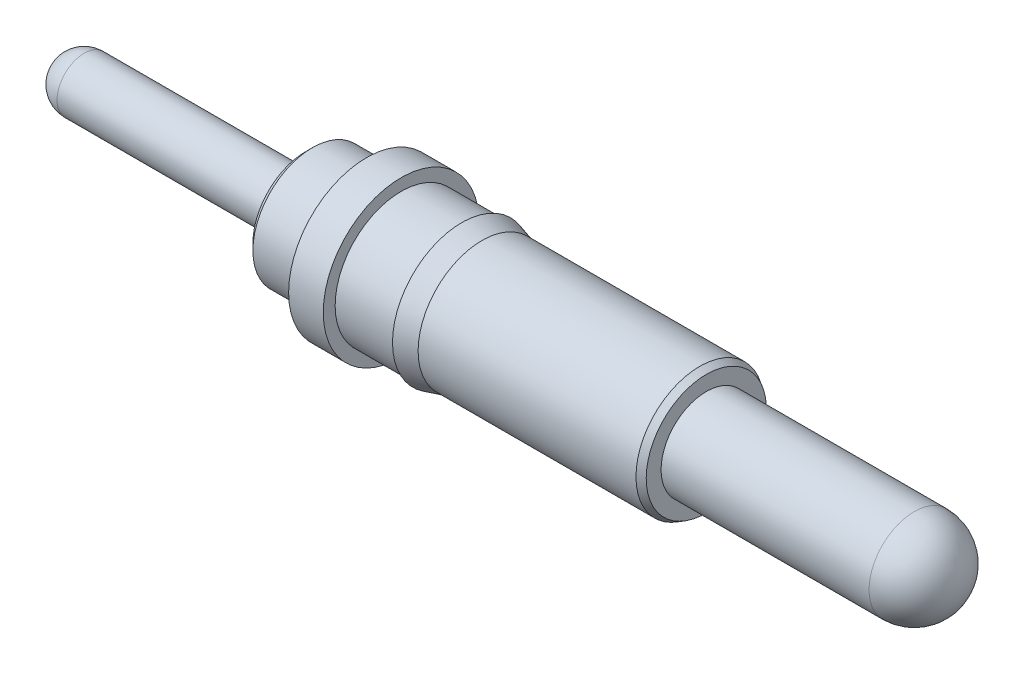
ISO-10303-21;
HEADER;
FILE_DESCRIPTION(('STEP AP214'),'2;1');
FILE_NAME('part.step','',(''),(''),'','','');
FILE_SCHEMA(('AUTOMOTIVE_DESIGN { 1 0 10303 214 1 1 1 1 }'));
ENDSEC;
DATA;
#1=APPLICATION_CONTEXT('core data for automotive mechanical design processes');
#2=APPLICATION_PROTOCOL_DEFINITION('international standard','automotive_design',2000,#1);
#3=PRODUCT_CONTEXT('',#1,'mechanical');
#4=PRODUCT('Part','Part','',(#3));
#5=PRODUCT_RELATED_PRODUCT_CATEGORY('part','',(#4));
#6=PRODUCT_DEFINITION_FORMATION('','',#4);
#7=PRODUCT_DEFINITION_CONTEXT('part definition',#1,'design');
#8=PRODUCT_DEFINITION('design','',#6,#7);
#9=PRODUCT_DEFINITION_SHAPE('','',#8);
#10=(LENGTH_UNIT() NAMED_UNIT(*) SI_UNIT(.MILLI.,.METRE.));
#11=(NAMED_UNIT(*) PLANE_ANGLE_UNIT() SI_UNIT($,.RADIAN.));
#12=(NAMED_UNIT(*) SI_UNIT($,.STERADIAN.) SOLID_ANGLE_UNIT());
#13=UNCERTAINTY_MEASURE_WITH_UNIT(LENGTH_MEASURE(1.E-05),#10,'distance_accuracy_value','');
#14=(GEOMETRIC_REPRESENTATION_CONTEXT(3) GLOBAL_UNCERTAINTY_ASSIGNED_CONTEXT((#13)) GLOBAL_UNIT_ASSIGNED_CONTEXT((#10,
#11,#12)) REPRESENTATION_CONTEXT('',''));
#15=CARTESIAN_POINT('',(0.,0.,0.));
#16=DIRECTION('',(0.,0.,1.));
#17=DIRECTION('',(1.,0.,0.));
#18=AXIS2_PLACEMENT_3D('',#15,#16,#17);
#19=CARTESIAN_POINT('',(0.317499999999853,1.69894480428479E-13,0.));
#20=DIRECTION('',(-1.,0.,0.));
#21=DIRECTION('',(0.,1.,0.));
#22=AXIS2_PLACEMENT_3D('',#19,#20,#21);
#23=SPHERICAL_SURFACE('',#22,0.317499999999853);
#24=CARTESIAN_POINT('',(0.317499999999853,0.,0.));
#25=DIRECTION('',(-1.,0.,0.));
#26=DIRECTION('',(0.,0.,1.));
#27=AXIS2_PLACEMENT_3D('',#24,#25,#26);
#28=CIRCLE('',#27,0.317500000000023);
#29=CARTESIAN_POINT('',(0.317499999999853,0.,0.317500000000023));
#30=VERTEX_POINT('',#29);
#31=EDGE_CURVE('E81',#30,#30,#28,.T.);
#32=ORIENTED_EDGE('',*,*,#31,.T.);
#33=EDGE_LOOP('',(#32));
#34=FACE_BOUND('',#33,.T.);
#35=ADVANCED_FACE('F32',(#34),#23,.T.);
#36=CARTESIAN_POINT('',(10.0609400000001,0.,0.));
#37=DIRECTION('',(-1.,0.,0.));
#38=DIRECTION('',(0.,1.,0.));
#39=AXIS2_PLACEMENT_3D('',#36,#37,#38);
#40=SPHERICAL_SURFACE('',#39,0.530859999999943);
#41=CARTESIAN_POINT('',(10.0609400000001,0.,0.));
#42=DIRECTION('',(-1.,0.,0.));
#43=DIRECTION('',(0.,0.,1.));
#44=AXIS2_PLACEMENT_3D('',#41,#42,#43);
#45=CIRCLE('',#44,0.530859999999943);
#46=CARTESIAN_POINT('',(10.0609400000001,0.,0.530859999999943));
#47=VERTEX_POINT('',#46);
#48=EDGE_CURVE('E10',#47,#47,#45,.T.);
#49=ORIENTED_EDGE('',*,*,#48,.F.);
#50=EDGE_LOOP('',(#49));
#51=FACE_BOUND('',#50,.T.);
#52=ADVANCED_FACE('F165',(#51),#40,.T.);
#53=CARTESIAN_POINT('',(0.,0.,0.));
#54=DIRECTION('',(-1.,0.,0.));
#55=DIRECTION('',(0.,0.,1.));
#56=AXIS2_PLACEMENT_3D('',#53,#54,#55);
#57=CYLINDRICAL_SURFACE('',#56,0.530859999999915);
#58=CARTESIAN_POINT('',(7.6200000000001,0.,0.));
#59=DIRECTION('',(-1.,0.,0.));
#60=DIRECTION('',(0.,0.,1.));
#61=AXIS2_PLACEMENT_3D('',#58,#59,#60);
#62=CIRCLE('',#61,0.530859999999887);
#63=CARTESIAN_POINT('',(7.6200000000001,0.,0.530859999999887));
#64=VERTEX_POINT('',#63);
#65=EDGE_CURVE('E38',#64,#64,#62,.T.);
#66=ORIENTED_EDGE('',*,*,#65,.F.);
#67=EDGE_LOOP('',(#66));
#68=FACE_BOUND('',#67,.T.);
#69=ORIENTED_EDGE('',*,*,#48,.T.);
#70=EDGE_LOOP('',(#69));
#71=FACE_BOUND('',#70,.T.);
#72=ADVANCED_FACE('F160',(#68,#71),#57,.T.);
#73=CARTESIAN_POINT('',(7.6200000000001,0.705305909487751,0.));
#74=DIRECTION('',(-1.,0.,0.));
#75=DIRECTION('',(0.,0.,1.));
#76=AXIS2_PLACEMENT_3D('',#73,#74,#75);
#77=PLANE('',#76);
#78=CARTESIAN_POINT('',(7.6200000000001,0.,0.));
#79=DIRECTION('',(-1.,0.,0.));
#80=DIRECTION('',(0.,0.,1.));
#81=AXIS2_PLACEMENT_3D('',#78,#79,#80);
#82=CIRCLE('',#81,0.705305909487751);
#83=CARTESIAN_POINT('',(7.6200000000001,0.,0.705305909487751));
#84=VERTEX_POINT('',#83);
#85=EDGE_CURVE('E42',#84,#84,#82,.T.);
#86=ORIENTED_EDGE('',*,*,#85,.F.);
#87=EDGE_LOOP('',(#86));
#88=FACE_BOUND('',#87,.T.);
#89=ORIENTED_EDGE('',*,*,#65,.T.);
#90=EDGE_LOOP('',(#89));
#91=FACE_BOUND('',#90,.T.);
#92=ADVANCED_FACE('F155',(#88,#91),#77,.F.);
#93=CARTESIAN_POINT('',(7.6200000000001,0.,0.));
#94=DIRECTION('',(-1.,0.,0.));
#95=DIRECTION('',(0.,0.,1.));
#96=AXIS2_PLACEMENT_3D('',#93,#94,#95);
#97=CONICAL_SURFACE('',#96,0.705305909487751,0.523598775598372);
#98=CARTESIAN_POINT('',(7.54380000000005,0.,0.));
#99=DIRECTION('',(-1.,0.,0.));
#100=DIRECTION('',(0.,0.,1.));
#101=AXIS2_PLACEMENT_3D('',#98,#99,#100);
#102=CIRCLE('',#101,0.749300000000036);
#103=CARTESIAN_POINT('',(7.54380000000005,0.,0.749300000000036));
#104=VERTEX_POINT('',#103);
#105=EDGE_CURVE('E46',#104,#104,#102,.T.);
#106=ORIENTED_EDGE('',*,*,#105,.F.);
#107=EDGE_LOOP('',(#106));
#108=FACE_BOUND('',#107,.T.);
#109=ORIENTED_EDGE('',*,*,#85,.T.);
#110=EDGE_LOOP('',(#109));
#111=FACE_BOUND('',#110,.T.);
#112=ADVANCED_FACE('F149',(#108,#111),#97,.T.);
#113=CARTESIAN_POINT('',(0.,0.,0.));
#114=DIRECTION('',(-1.,0.,0.));
#115=DIRECTION('',(0.,0.,1.));
#116=AXIS2_PLACEMENT_3D('',#113,#114,#115);
#117=CYLINDRICAL_SURFACE('',#116,0.749300000000036);
#118=CARTESIAN_POINT('',(4.98678522628056,0.,0.));
#119=DIRECTION('',(-1.,0.,0.));
#120=DIRECTION('',(0.,0.,1.));
#121=AXIS2_PLACEMENT_3D('',#118,#119,#120);
#122=CIRCLE('',#121,0.749300000000036);
#123=CARTESIAN_POINT('',(4.98678522628056,0.,0.749300000000036));
#124=VERTEX_POINT('',#123);
#125=EDGE_CURVE('E51',#124,#124,#122,.T.);
#126=ORIENTED_EDGE('',*,*,#125,.F.);
#127=EDGE_LOOP('',(#126));
#128=FACE_BOUND('',#127,.T.);
#129=ORIENTED_EDGE('',*,*,#105,.T.);
#130=EDGE_LOOP('',(#129));
#131=FACE_BOUND('',#130,.T.);
#132=ADVANCED_FACE('F143',(#128,#131),#117,.T.);
#133=CARTESIAN_POINT('',(4.98678522628056,0.,0.));
#134=DIRECTION('',(-1.,0.,0.));
#135=DIRECTION('',(0.,0.,1.));
#136=AXIS2_PLACEMENT_3D('',#133,#134,#135);
#137=CONICAL_SURFACE('',#136,0.749300000000036,0.261799387799377);
#138=CARTESIAN_POINT('',(4.74980000000002,0.,0.));
#139=DIRECTION('',(-1.,0.,0.));
#140=DIRECTION('',(0.,0.,1.));
#141=AXIS2_PLACEMENT_3D('',#138,#139,#140);
#142=CIRCLE('',#141,0.812800000000071);
#143=CARTESIAN_POINT('',(4.74980000000002,0.,0.812800000000071));
#144=VERTEX_POINT('',#143);
#145=EDGE_CURVE('E54',#144,#144,#142,.T.);
#146=ORIENTED_EDGE('',*,*,#145,.F.);
#147=EDGE_LOOP('',(#146));
#148=FACE_BOUND('',#147,.T.);
#149=ORIENTED_EDGE('',*,*,#125,.T.);
#150=EDGE_LOOP('',(#149));
#151=FACE_BOUND('',#150,.T.);
#152=ADVANCED_FACE('F137',(#148,#151),#137,.T.);
#153=CARTESIAN_POINT('',(4.74980000000002,0.774700000000045,0.));
#154=DIRECTION('',(1.,0.,0.));
#155=DIRECTION('',(0.,0.,-1.));
#156=AXIS2_PLACEMENT_3D('',#153,#154,#155);
#157=PLANE('',#156);
#158=CARTESIAN_POINT('',(4.74980000000002,0.,0.));
#159=DIRECTION('',(-1.,0.,0.));
#160=DIRECTION('',(0.,0.,1.));
#161=AXIS2_PLACEMENT_3D('',#158,#159,#160);
#162=CIRCLE('',#161,0.774700000000045);
#163=CARTESIAN_POINT('',(4.74980000000002,0.,0.774700000000045));
#164=VERTEX_POINT('',#163);
#165=EDGE_CURVE('E57',#164,#164,#162,.T.);
#166=ORIENTED_EDGE('',*,*,#165,.F.);
#167=EDGE_LOOP('',(#166));
#168=FACE_BOUND('',#167,.T.);
#169=ORIENTED_EDGE('',*,*,#145,.T.);
#170=EDGE_LOOP('',(#169));
#171=FACE_BOUND('',#170,.T.);
#172=ADVANCED_FACE('F131',(#168,#171),#157,.F.);
#173=CARTESIAN_POINT('',(0.,0.,0.));
#174=DIRECTION('',(-1.,0.,0.));
#175=DIRECTION('',(0.,0.,1.));
#176=AXIS2_PLACEMENT_3D('',#173,#174,#175);
#177=CYLINDRICAL_SURFACE('',#176,0.774700000000045);
#178=CARTESIAN_POINT('',(4.03860000000005,0.,0.));
#179=DIRECTION('',(-1.,0.,0.));
#180=DIRECTION('',(0.,0.,1.));
#181=AXIS2_PLACEMENT_3D('',#178,#179,#180);
#182=CIRCLE('',#181,0.774700000000045);
#183=CARTESIAN_POINT('',(4.03860000000005,0.,0.774700000000045));
#184=VERTEX_POINT('',#183);
#185=EDGE_CURVE('E60',#184,#184,#182,.T.);
#186=ORIENTED_EDGE('',*,*,#185,.F.);
#187=EDGE_LOOP('',(#186));
#188=FACE_BOUND('',#187,.T.);
#189=ORIENTED_EDGE('',*,*,#165,.T.);
#190=EDGE_LOOP('',(#189));
#191=FACE_BOUND('',#190,.T.);
#192=ADVANCED_FACE('F125',(#188,#191),#177,.T.);
#193=CARTESIAN_POINT('',(4.03860000000005,0.914400000000037,0.));
#194=DIRECTION('',(-1.,0.,0.));
#195=DIRECTION('',(0.,0.,1.));
#196=AXIS2_PLACEMENT_3D('',#193,#194,#195);
#197=PLANE('',#196);
#198=CARTESIAN_POINT('',(4.03860000000005,0.,0.));
#199=DIRECTION('',(-1.,0.,0.));
#200=DIRECTION('',(0.,0.,1.));
#201=AXIS2_PLACEMENT_3D('',#198,#199,#200);
#202=CIRCLE('',#201,0.914400000000037);
#203=CARTESIAN_POINT('',(4.03860000000005,0.,0.914400000000037));
#204=VERTEX_POINT('',#203);
#205=EDGE_CURVE('E63',#204,#204,#202,.T.);
#206=ORIENTED_EDGE('',*,*,#205,.F.);
#207=EDGE_LOOP('',(#206));
#208=FACE_BOUND('',#207,.T.);
#209=ORIENTED_EDGE('',*,*,#185,.T.);
#210=EDGE_LOOP('',(#209));
#211=FACE_BOUND('',#210,.T.);
#212=ADVANCED_FACE('F119',(#208,#211),#197,.F.);
#213=CARTESIAN_POINT('',(0.,0.,0.));
#214=DIRECTION('',(-1.,0.,0.));
#215=DIRECTION('',(0.,0.,1.));
#216=AXIS2_PLACEMENT_3D('',#213,#214,#215);
#217=CYLINDRICAL_SURFACE('',#216,0.914400000000037);
#218=CARTESIAN_POINT('',(3.63220000000005,0.,0.));
#219=DIRECTION('',(-1.,0.,0.));
#220=DIRECTION('',(0.,0.,1.));
#221=AXIS2_PLACEMENT_3D('',#218,#219,#220);
#222=CIRCLE('',#221,0.914400000000037);
#223=CARTESIAN_POINT('',(3.63220000000005,0.,0.914400000000037));
#224=VERTEX_POINT('',#223);
#225=EDGE_CURVE('E66',#224,#224,#222,.T.);
#226=ORIENTED_EDGE('',*,*,#225,.F.);
#227=EDGE_LOOP('',(#226));
#228=FACE_BOUND('',#227,.T.);
#229=ORIENTED_EDGE('',*,*,#205,.T.);
#230=EDGE_LOOP('',(#229));
#231=FACE_BOUND('',#230,.T.);
#232=ADVANCED_FACE('F113',(#228,#231),#217,.T.);
#233=CARTESIAN_POINT('',(3.63220000000005,0.698499999999853,0.));
#234=DIRECTION('',(1.,0.,0.));
#235=DIRECTION('',(0.,0.,-1.));
#236=AXIS2_PLACEMENT_3D('',#233,#234,#235);
#237=PLANE('',#236);
#238=CARTESIAN_POINT('',(3.63220000000005,0.,0.));
#239=DIRECTION('',(-1.,0.,0.));
#240=DIRECTION('',(0.,0.,1.));
#241=AXIS2_PLACEMENT_3D('',#238,#239,#240);
#242=CIRCLE('',#241,0.698499999999853);
#243=CARTESIAN_POINT('',(3.63220000000005,0.,0.698499999999853));
#244=VERTEX_POINT('',#243);
#245=EDGE_CURVE('E69',#244,#244,#242,.T.);
#246=ORIENTED_EDGE('',*,*,#245,.F.);
#247=EDGE_LOOP('',(#246));
#248=FACE_BOUND('',#247,.T.);
#249=ORIENTED_EDGE('',*,*,#225,.T.);
#250=EDGE_LOOP('',(#249));
#251=FACE_BOUND('',#250,.T.);
#252=ADVANCED_FACE('F107',(#248,#251),#237,.F.);
#253=CARTESIAN_POINT('',(0.,0.,0.));
#254=DIRECTION('',(-1.,0.,0.));
#255=DIRECTION('',(0.,0.,1.));
#256=AXIS2_PLACEMENT_3D('',#253,#254,#255);
#257=CYLINDRICAL_SURFACE('',#256,0.698499999999853);
#258=CARTESIAN_POINT('',(2.9971999999999,0.,0.));
#259=DIRECTION('',(-1.,0.,0.));
#260=DIRECTION('',(0.,0.,1.));
#261=AXIS2_PLACEMENT_3D('',#258,#259,#260);
#262=CIRCLE('',#261,0.698499999999853);
#263=CARTESIAN_POINT('',(2.9971999999999,0.,0.698499999999853));
#264=VERTEX_POINT('',#263);
#265=EDGE_CURVE('E72',#264,#264,#262,.T.);
#266=ORIENTED_EDGE('',*,*,#265,.F.);
#267=EDGE_LOOP('',(#266));
#268=FACE_BOUND('',#267,.T.);
#269=ORIENTED_EDGE('',*,*,#245,.T.);
#270=EDGE_LOOP('',(#269));
#271=FACE_BOUND('',#270,.T.);
#272=ADVANCED_FACE('F101',(#268,#271),#257,.T.);
#273=CARTESIAN_POINT('',(2.9971999999999,0.,0.));
#274=DIRECTION('',(1.,0.,0.));
#275=DIRECTION('',(0.,0.,-1.));
#276=AXIS2_PLACEMENT_3D('',#273,#274,#275);
#277=CONICAL_SURFACE('',#276,0.698499999999853,0.785398163397985);
#278=CARTESIAN_POINT('',(2.9210000000001,0.,0.));
#279=DIRECTION('',(-1.,0.,0.));
#280=DIRECTION('',(0.,0.,1.));
#281=AXIS2_PLACEMENT_3D('',#278,#279,#280);
#282=CIRCLE('',#281,0.622299999999966);
#283=CARTESIAN_POINT('',(2.9210000000001,0.,0.622299999999966));
#284=VERTEX_POINT('',#283);
#285=EDGE_CURVE('E75',#284,#284,#282,.T.);
#286=ORIENTED_EDGE('',*,*,#285,.F.);
#287=EDGE_LOOP('',(#286));
#288=FACE_BOUND('',#287,.T.);
#289=ORIENTED_EDGE('',*,*,#265,.T.);
#290=EDGE_LOOP('',(#289));
#291=FACE_BOUND('',#290,.T.);
#292=ADVANCED_FACE('F95',(#288,#291),#277,.T.);
#293=CARTESIAN_POINT('',(2.9210000000001,0.317500000000023,0.));
#294=DIRECTION('',(1.,0.,0.));
#295=DIRECTION('',(0.,0.,-1.));
#296=AXIS2_PLACEMENT_3D('',#293,#294,#295);
#297=PLANE('',#296);
#298=CARTESIAN_POINT('',(2.9210000000001,0.,0.));
#299=DIRECTION('',(-1.,0.,0.));
#300=DIRECTION('',(0.,0.,1.));
#301=AXIS2_PLACEMENT_3D('',#298,#299,#300);
#302=CIRCLE('',#301,0.317500000000023);
#303=CARTESIAN_POINT('',(2.9210000000001,0.,0.317500000000023));
#304=VERTEX_POINT('',#303);
#305=EDGE_CURVE('E78',#304,#304,#302,.T.);
#306=ORIENTED_EDGE('',*,*,#305,.F.);
#307=EDGE_LOOP('',(#306));
#308=FACE_BOUND('',#307,.T.);
#309=ORIENTED_EDGE('',*,*,#285,.T.);
#310=EDGE_LOOP('',(#309));
#311=FACE_BOUND('',#310,.T.);
#312=ADVANCED_FACE('F89',(#308,#311),#297,.F.);
#313=CARTESIAN_POINT('',(0.,0.,0.));
#314=DIRECTION('',(-1.,0.,0.));
#315=DIRECTION('',(0.,0.,1.));
#316=AXIS2_PLACEMENT_3D('',#313,#314,#315);
#317=CYLINDRICAL_SURFACE('',#316,0.317500000000023);
#318=ORIENTED_EDGE('',*,*,#31,.F.);
#319=EDGE_LOOP('',(#318));
#320=FACE_BOUND('',#319,.T.);
#321=ORIENTED_EDGE('',*,*,#305,.T.);
#322=EDGE_LOOP('',(#321));
#323=FACE_BOUND('',#322,.T.);
#324=ADVANCED_FACE('F86',(#320,#323),#317,.T.);
#325=CLOSED_SHELL('',(#35,#52,#72,#92,#112,#132,#152,#172,#192,#212,#232,#252,#272,#292,#312,#324));
#326=MANIFOLD_SOLID_BREP('B2',#325);
#327=ADVANCED_BREP_SHAPE_REPRESENTATION('',(#18,#326),#14);
#328=SHAPE_DEFINITION_REPRESENTATION(#9,#327);
ENDSEC;
END-ISO-10303-21;
